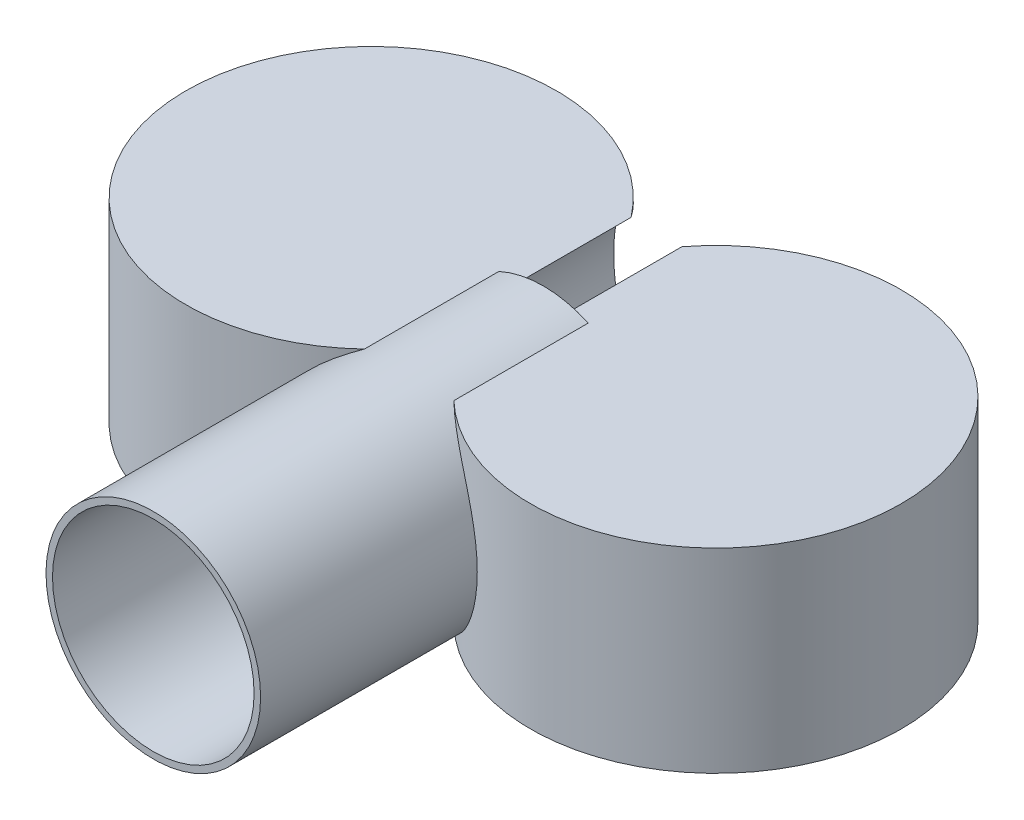
ISO-10303-21;
HEADER;
FILE_DESCRIPTION(('STEP AP214'),'2;1');
FILE_NAME('part.step','',(''),(''),'','','');
FILE_SCHEMA(('AUTOMOTIVE_DESIGN { 1 0 10303 214 1 1 1 1 }'));
ENDSEC;
DATA;
#1=APPLICATION_CONTEXT('core data for automotive mechanical design processes');
#2=APPLICATION_PROTOCOL_DEFINITION('international standard','automotive_design',2000,#1);
#3=PRODUCT_CONTEXT('',#1,'mechanical');
#4=PRODUCT('Part','Part','',(#3));
#5=PRODUCT_RELATED_PRODUCT_CATEGORY('part','',(#4));
#6=PRODUCT_DEFINITION_FORMATION('','',#4);
#7=PRODUCT_DEFINITION_CONTEXT('part definition',#1,'design');
#8=PRODUCT_DEFINITION('design','',#6,#7);
#9=PRODUCT_DEFINITION_SHAPE('','',#8);
#10=(LENGTH_UNIT() NAMED_UNIT(*) SI_UNIT(.MILLI.,.METRE.));
#11=(NAMED_UNIT(*) PLANE_ANGLE_UNIT() SI_UNIT($,.RADIAN.));
#12=(NAMED_UNIT(*) SI_UNIT($,.STERADIAN.) SOLID_ANGLE_UNIT());
#13=UNCERTAINTY_MEASURE_WITH_UNIT(LENGTH_MEASURE(1.E-05),#10,'distance_accuracy_value','');
#14=(GEOMETRIC_REPRESENTATION_CONTEXT(3) GLOBAL_UNCERTAINTY_ASSIGNED_CONTEXT((#13)) GLOBAL_UNIT_ASSIGNED_CONTEXT((#10,
#11,#12)) REPRESENTATION_CONTEXT('',''));
#15=CARTESIAN_POINT('',(0.,0.,0.));
#16=DIRECTION('',(0.,0.,1.));
#17=DIRECTION('',(1.,0.,0.));
#18=AXIS2_PLACEMENT_3D('',#15,#16,#17);
#19=CARTESIAN_POINT('',(-16.0192558049496,30.,0.));
#20=DIRECTION('',(0.,1.,0.));
#21=DIRECTION('',(0.,0.,1.));
#22=AXIS2_PLACEMENT_3D('',#19,#20,#21);
#23=PLANE('',#22);
#24=DIRECTION('',(0.,0.,1.));
#25=VECTOR('',#24,1.);
#26=CARTESIAN_POINT('',(-19.924380642903,30.,-28.5));
#27=LINE('',#26,#25);
#28=CARTESIAN_POINT('',(-19.924380642903,30.,-17.3701357626107));
#29=VERTEX_POINT('',#28);
#30=CARTESIAN_POINT('',(-19.924380642903,30.,0.));
#31=VERTEX_POINT('',#30);
#32=EDGE_CURVE('E53',#29,#31,#27,.T.);
#33=ORIENTED_EDGE('',*,*,#32,.F.);
#34=CARTESIAN_POINT('',(-42.5192558049496,30.,0.));
#35=DIRECTION('',(0.,1.,0.));
#36=DIRECTION('',(0.,0.,1.));
#37=AXIS2_PLACEMENT_3D('',#34,#35,#36);
#38=CIRCLE('',#37,28.5);
#39=CARTESIAN_POINT('',(-22.8931193473834,30.,20.6655454258771));
#40=VERTEX_POINT('',#39);
#41=EDGE_CURVE('E157',#29,#40,#38,.T.);
#42=ORIENTED_EDGE('',*,*,#41,.T.);
#43=DIRECTION('',(0.,0.,-1.));
#44=VECTOR('',#43,1.);
#45=CARTESIAN_POINT('',(-22.8931193473834,30.,60.));
#46=LINE('',#45,#44);
#47=CARTESIAN_POINT('',(-22.8931193473834,30.,0.));
#48=VERTEX_POINT('',#47);
#49=EDGE_CURVE('E131',#40,#48,#46,.T.);
#50=ORIENTED_EDGE('',*,*,#49,.T.);
#51=DIRECTION('',(1.,0.,0.));
#52=VECTOR('',#51,1.);
#53=CARTESIAN_POINT('',(-16.0192558049496,30.,0.));
#54=LINE('',#53,#52);
#55=EDGE_CURVE('E116',#48,#31,#54,.T.);
#56=ORIENTED_EDGE('',*,*,#55,.T.);
#57=EDGE_LOOP('',(#33,#42,#50,#56));
#58=FACE_BOUND('',#57,.T.);
#59=ADVANCED_FACE('F37',(#58),#23,.T.);
#60=CARTESIAN_POINT('',(-16.0192558049496,0.,0.));
#61=DIRECTION('',(0.,1.,0.));
#62=DIRECTION('',(0.,0.,1.));
#63=AXIS2_PLACEMENT_3D('',#60,#61,#62);
#64=PLANE('',#63);
#65=CARTESIAN_POINT('',(-42.5192558049496,0.,0.));
#66=DIRECTION('',(0.,1.,0.));
#67=DIRECTION('',(0.,0.,1.));
#68=AXIS2_PLACEMENT_3D('',#65,#66,#67);
#69=CIRCLE('',#68,28.5);
#70=CARTESIAN_POINT('',(-19.924380642903,0.,-17.3701357626107));
#71=VERTEX_POINT('',#70);
#72=CARTESIAN_POINT('',(-22.8931193473834,0.,20.6655454258771));
#73=VERTEX_POINT('',#72);
#74=EDGE_CURVE('E158',#71,#73,#69,.T.);
#75=ORIENTED_EDGE('',*,*,#74,.F.);
#76=DIRECTION('',(0.,0.,1.));
#77=VECTOR('',#76,1.);
#78=CARTESIAN_POINT('',(-19.924380642903,0.,-28.5));
#79=LINE('',#78,#77);
#80=CARTESIAN_POINT('',(-19.924380642903,0.,0.));
#81=VERTEX_POINT('',#80);
#82=EDGE_CURVE('E185',#71,#81,#79,.T.);
#83=ORIENTED_EDGE('',*,*,#82,.T.);
#84=DIRECTION('',(1.,0.,0.));
#85=VECTOR('',#84,1.);
#86=CARTESIAN_POINT('',(-16.0192558049496,0.,0.));
#87=LINE('',#86,#85);
#88=CARTESIAN_POINT('',(-22.8931193473834,0.,0.));
#89=VERTEX_POINT('',#88);
#90=EDGE_CURVE('E164',#89,#81,#87,.T.);
#91=ORIENTED_EDGE('',*,*,#90,.F.);
#92=DIRECTION('',(0.,0.,-1.));
#93=VECTOR('',#92,1.);
#94=CARTESIAN_POINT('',(-22.8931193473834,0.,60.));
#95=LINE('',#94,#93);
#96=EDGE_CURVE('E167',#73,#89,#95,.T.);
#97=ORIENTED_EDGE('',*,*,#96,.F.);
#98=EDGE_LOOP('',(#75,#83,#91,#97));
#99=FACE_BOUND('',#98,.T.);
#100=ADVANCED_FACE('F212',(#99),#64,.F.);
#101=CARTESIAN_POINT('',(10.4807441950504,30.,0.));
#102=DIRECTION('',(0.,-1.,0.));
#103=DIRECTION('',(0.,0.,-1.));
#104=AXIS2_PLACEMENT_3D('',#101,#102,#103);
#105=CYLINDRICAL_SURFACE('',#104,28.5);
#106=CARTESIAN_POINT('',(10.4807441950504,0.,0.));
#107=DIRECTION('',(0.,1.,0.));
#108=DIRECTION('',(0.,0.,1.));
#109=AXIS2_PLACEMENT_3D('',#106,#107,#108);
#110=CIRCLE('',#109,28.5);
#111=CARTESIAN_POINT('',(-9.14539226251587,0.,20.6655454258771));
#112=VERTEX_POINT('',#111);
#113=CARTESIAN_POINT('',(-12.1141309669963,0.,-17.3701357626107));
#114=VERTEX_POINT('',#113);
#115=EDGE_CURVE('E155',#112,#114,#110,.T.);
#116=ORIENTED_EDGE('',*,*,#115,.T.);
#117=CARTESIAN_POINT('',(-12.1141309669963,0.,-17.3701357626107));
#118=CARTESIAN_POINT('',(-11.9643394035228,0.0389997995964887,-17.5649867570918));
#119=CARTESIAN_POINT('',(-11.8123198583206,0.0809701944037257,-17.7575103783505));
#120=CARTESIAN_POINT('',(-11.5041128860694,0.171335100360802,-18.1376940368291));
#121=CARTESIAN_POINT('',(-11.3479248895952,0.219730492813901,-18.325353402601));
#122=CARTESIAN_POINT('',(-10.8732513591321,0.375376916966445,-18.881054260297));
#123=CARTESIAN_POINT('',(-10.5489909917428,0.493003547680562,-19.2413838368355));
#124=CARTESIAN_POINT('',(-9.88725622133457,0.760040729833842,-19.9405953371826));
#125=CARTESIAN_POINT('',(-9.54972949700646,0.909590211933771,-20.2793748266602));
#126=CARTESIAN_POINT('',(-8.86741901195853,1.24335487315917,-20.9313392681735));
#127=CARTESIAN_POINT('',(-8.52263952433425,1.42755012153694,-21.244538787818));
#128=CARTESIAN_POINT('',(-7.88554667618215,1.80125455755003,-21.7962853684549));
#129=CARTESIAN_POINT('',(-7.59351631634458,1.98536468314365,-22.0388235652972));
#130=CARTESIAN_POINT('',(-7.01169270803424,2.38106434126637,-22.5034039837079));
#131=CARTESIAN_POINT('',(-6.72189948799382,2.59265422243516,-22.7254459451764));
#132=CARTESIAN_POINT('',(-6.14933519157098,3.04312003283263,-23.1477145130866));
#133=CARTESIAN_POINT('',(-5.86654719370049,3.28192035990687,-23.3479986831245));
#134=CARTESIAN_POINT('',(-5.31130217880728,3.78703581245013,-23.7270793114327));
#135=CARTESIAN_POINT('',(-5.03884501613893,4.05335054981966,-23.9058760727126));
#136=CARTESIAN_POINT('',(-4.50726771117636,4.61376415639717,-24.2427093278497));
#137=CARTESIAN_POINT('',(-4.24820771230669,4.90797391099585,-24.4006564412553));
#138=CARTESIAN_POINT('',(-3.74862474770634,5.52169998914601,-24.6953276466742));
#139=CARTESIAN_POINT('',(-3.50810222752306,5.84121692058025,-24.8320512286611));
#140=CARTESIAN_POINT('',(-3.04902800723369,6.50377802766299,-25.0851364838346));
#141=CARTESIAN_POINT('',(-2.83049790895105,6.84684478925737,-25.2014782186559));
#142=CARTESIAN_POINT('',(-2.41890126340133,7.55368551432101,-25.4146197463843));
#143=CARTESIAN_POINT('',(-2.22583366566237,7.9174586226496,-25.511420345561));
#144=CARTESIAN_POINT('',(-1.87857088684386,8.64058217073558,-25.6813638220029));
#145=CARTESIAN_POINT('',(-1.72274302426728,8.99889985607123,-25.7555741422182));
#146=CARTESIAN_POINT('',(-1.43784572572456,9.72876359385339,-25.8886452288691));
#147=CARTESIAN_POINT('',(-1.30877513179847,10.100309073032,-25.9475066595789));
#148=CARTESIAN_POINT('',(-1.07887733405021,10.8538879201915,-26.0507396703101));
#149=CARTESIAN_POINT('',(-0.978042881885634,11.2359185688829,-26.0951149694712));
#150=CARTESIAN_POINT('',(-0.805660131668931,12.0078578706707,-26.170134173868));
#151=CARTESIAN_POINT('',(-0.734112307743402,12.3977666512004,-26.2007778568006));
#152=CARTESIAN_POINT('',(-0.620856469490291,13.1840661824016,-26.2489670386268));
#153=CARTESIAN_POINT('',(-0.579251867130004,13.5804746065453,-26.266467153844));
#154=CARTESIAN_POINT('',(-0.526709327402839,14.3756749094872,-26.2885294576252));
#155=CARTESIAN_POINT('',(-0.51577136292428,14.774466786178,-26.2930916576273));
#156=CARTESIAN_POINT('',(-0.524672952727863,15.5716892810288,-26.2893669879278));
#157=CARTESIAN_POINT('',(-0.544515741908747,15.9701198568146,-26.2810787677134));
#158=CARTESIAN_POINT('',(-0.61478387119505,16.7637906130008,-26.2514895886808));
#159=CARTESIAN_POINT('',(-0.665209356186057,17.1590307782775,-26.2301885682144));
#160=CARTESIAN_POINT('',(-0.796639509136035,17.9466234455669,-26.1739519798813));
#161=CARTESIAN_POINT('',(-0.87788129416651,18.3389288694369,-26.1389106140386));
#162=CARTESIAN_POINT('',(-1.07003007288673,19.1146459121849,-26.0545698482814));
#163=CARTESIAN_POINT('',(-1.18093720092214,19.4980574907767,-26.0052703837961));
#164=CARTESIAN_POINT('',(-1.43115900561939,20.2531514862145,-25.8916091878038));
#165=CARTESIAN_POINT('',(-1.57047020346545,20.6248353329945,-25.8272493006942));
#166=CARTESIAN_POINT('',(-1.8758726677492,21.3538076126325,-25.6825339751768));
#167=CARTESIAN_POINT('',(-2.04196360287517,21.7110962235162,-25.6021787346563));
#168=CARTESIAN_POINT('',(-2.39746523658256,22.4059374542562,-25.4252002575366));
#169=CARTESIAN_POINT('',(-2.5866810772232,22.7436238345238,-25.3287107329343));
#170=CARTESIAN_POINT('',(-2.98704794709004,23.3999594943983,-25.1181151016111));
#171=CARTESIAN_POINT('',(-3.19819874156863,23.7186089776803,-25.0040091834142));
#172=CARTESIAN_POINT('',(-3.63958118592021,24.3347320616506,-24.7574285071341));
#173=CARTESIAN_POINT('',(-3.86980727100044,24.6322117913978,-24.6249590986539));
#174=CARTESIAN_POINT('',(-4.34626992956831,25.2044113792448,-24.3410461112347));
#175=CARTESIAN_POINT('',(-4.59250642967599,25.4791313416453,-24.189602619256));
#176=CARTESIAN_POINT('',(-5.09647210277204,26.0033818690013,-23.8681634494785));
#177=CARTESIAN_POINT('',(-5.35414404720184,26.2530210925452,-23.698255085978));
#178=CARTESIAN_POINT('',(-5.87855631226374,26.7278017433376,-23.3393278745092));
#179=CARTESIAN_POINT('',(-6.14529660893054,26.9529432353207,-23.1503090770423));
#180=CARTESIAN_POINT('',(-6.68448267722995,27.3786124597056,-22.7533969697799));
#181=CARTESIAN_POINT('',(-6.95693039766051,27.5791316190159,-22.5454971294987));
#182=CARTESIAN_POINT('',(-7.50410736945299,27.955793744316,-22.1114691875723));
#183=CARTESIAN_POINT('',(-7.77883665591403,28.1319363345628,-21.8853408050354));
#184=CARTESIAN_POINT('',(-8.34478359026919,28.471007869507,-21.4008605963291));
#185=CARTESIAN_POINT('',(-8.63594876755042,28.6324036107925,-21.1413760251113));
#186=CARTESIAN_POINT('',(-9.21405521305679,28.9300028746471,-20.6038998748905));
#187=CARTESIAN_POINT('',(-9.50099592770492,29.0662031221521,-20.3259058962997));
#188=CARTESIAN_POINT('',(-10.0676261469168,29.3151614500014,-19.7528933087479));
#189=CARTESIAN_POINT('',(-10.3473186540464,29.4279293775679,-19.4578819180631));
#190=CARTESIAN_POINT('',(-10.8971242242333,29.6321477081298,-18.8521607052303));
#191=CARTESIAN_POINT('',(-11.1672401442262,29.7236045149169,-18.5414556331211));
#192=CARTESIAN_POINT('',(-11.547737582795,29.8415064031923,-18.0839440658996));
#193=CARTESIAN_POINT('',(-11.6627711298185,29.8756533715496,-17.9429086300732));
#194=CARTESIAN_POINT('',(-11.8903201480455,29.9404101169034,-17.6583862492576));
#195=CARTESIAN_POINT('',(-12.0028392001668,29.9710252219754,-17.5149033819583));
#196=CARTESIAN_POINT('',(-12.1141309669963,30.,-17.3701357626107));
#197=B_SPLINE_CURVE_WITH_KNOTS('',3,(#117,#118,#119,#120,#121,#122,#123,#124,#125,#126,#127,
#128,#129,#130,#131,#132,#133,#134,#135,#136,#137,#138,#139,#140,#141,#142,#143,#144,#145,#146,
#147,#148,#149,#150,#151,#152,#153,#154,#155,#156,#157,#158,#159,#160,#161,#162,#163,#164,#165,
#166,#167,#168,#169,#170,#171,#172,#173,#174,#175,#176,#177,#178,#179,#180,#181,#182,#183,#184,
#185,#186,#187,#188,#189,#190,#191,#192,#193,#194,#195,#196),.UNSPECIFIED.,.F.,.F.,(4,2,2,2,2,2,
2,2,2,2,2,2,2,2,2,2,2,2,2,2,2,2,2,2,2,2,2,2,2,2,2,2,2,2,2,2,2,2,2,4),(0.,0.746468085594687,
1.49303866862395,2.98784100299674,4.48928652787186,5.98987093997945,7.25428102916193,
8.51870716166821,9.77970211781029,11.0406792896464,12.3068977935395,13.5731467214492,
14.840627512389,16.1080559962231,17.2998103050309,18.4915130281553,19.682909554896,
20.8743253686108,22.0698363671622,23.265346308789,24.4609819008682,25.6566231573179,
26.8616573356116,28.0666969712452,29.2715891070507,30.4764663373979,31.6718126815616,
32.8671462344608,34.0621322949028,35.2571128787947,36.4466702968252,37.6362245714095,
38.8261918618265,40.0161774924818,41.2811871143768,42.5463610545811,43.8110022366964,
45.0752629145378,45.6307339255943,46.185355695872),.UNSPECIFIED.);
#198=CARTESIAN_POINT('',(-12.1141309669963,30.,-17.3701357626107));
#199=VERTEX_POINT('',#198);
#200=EDGE_CURVE('E182',#114,#199,#197,.T.);
#201=ORIENTED_EDGE('',*,*,#200,.T.);
#202=CARTESIAN_POINT('',(10.4807441950504,30.,0.));
#203=DIRECTION('',(0.,1.,0.));
#204=DIRECTION('',(0.,0.,1.));
#205=AXIS2_PLACEMENT_3D('',#202,#203,#204);
#206=CIRCLE('',#205,28.5);
#207=CARTESIAN_POINT('',(-9.14539226251587,30.,20.6655454258771));
#208=VERTEX_POINT('',#207);
#209=EDGE_CURVE('E109',#208,#199,#206,.T.);
#210=ORIENTED_EDGE('',*,*,#209,.F.);
#211=CARTESIAN_POINT('',(-9.14539226251587,0.,20.6655454258771));
#212=CARTESIAN_POINT('',(-8.99034684919225,0.0710509725734352,20.8127965277317));
#213=CARTESIAN_POINT('',(-8.8344480881234,0.145402013919614,20.957530345615));
#214=CARTESIAN_POINT('',(-8.52133903377766,0.300958588947565,21.2418345469368));
#215=CARTESIAN_POINT('',(-8.36412861839283,0.382164767369239,21.3814044429182));
#216=CARTESIAN_POINT('',(-7.89104690993257,0.636491120311163,21.7922381599609));
#217=CARTESIAN_POINT('',(-7.57384374104907,0.820265433371779,22.0555137588335));
#218=CARTESIAN_POINT('',(-6.93972569594383,1.21768167336473,22.5597333268601));
#219=CARTESIAN_POINT('',(-6.62281148725684,1.43135522297681,22.800653197041));
#220=CARTESIAN_POINT('',(-5.99406222899199,1.88906491390524,23.2590211216982));
#221=CARTESIAN_POINT('',(-5.6822259879246,2.13309381310662,23.476474751668));
#222=CARTESIAN_POINT('',(-5.06682475175206,2.65264714741573,23.88850926801));
#223=CARTESIAN_POINT('',(-4.76330300919431,2.92830762233303,24.0829834576576));
#224=CARTESIAN_POINT('',(-4.17067347359483,3.5094247330135,24.4480497072267));
#225=CARTESIAN_POINT('',(-3.88156702739612,3.81488414508327,24.6186395382783));
#226=CARTESIAN_POINT('',(-3.32276672728283,4.4534888860775,24.9362438034048));
#227=CARTESIAN_POINT('',(-3.05304248702504,4.78658903274363,25.0832956040062));
#228=CARTESIAN_POINT('',(-2.53663250762241,5.4786943058999,25.3551393731475));
#229=CARTESIAN_POINT('',(-2.28994521245141,5.8376976798536,25.4799328456409));
#230=CARTESIAN_POINT('',(-1.83791384174138,6.55559261209143,25.7013616623972));
#231=CARTESIAN_POINT('',(-1.63094506742191,6.91306993680374,25.7992746682137));
#232=CARTESIAN_POINT('',(-1.24293787971474,7.64593155390175,25.9778928211292));
#233=CARTESIAN_POINT('',(-1.06189851757271,8.02131519042715,26.0585985978917));
#234=CARTESIAN_POINT('',(-0.727720301277733,8.78760884780028,26.2040756622261));
#235=CARTESIAN_POINT('',(-0.574601913836098,9.17853000439004,26.2688352729803));
#236=CARTESIAN_POINT('',(-0.298097743657628,9.97286799592274,26.3834983154657));
#237=CARTESIAN_POINT('',(-0.174712471045995,10.3762850451213,26.4334014923116));
#238=CARTESIAN_POINT('',(0.0413909770163267,11.1940740650911,26.5194926323541));
#239=CARTESIAN_POINT('',(0.134009823681604,11.6084769421486,26.5556362268177));
#240=CARTESIAN_POINT('',(0.287116558226612,12.4440949211851,26.6147834496794));
#241=CARTESIAN_POINT('',(0.347604509158058,12.8653100097946,26.6377871038626));
#242=CARTESIAN_POINT('',(0.435862158662152,13.711571245228,26.6711937471481));
#243=CARTESIAN_POINT('',(0.463637733310623,14.1366166901844,26.681598999292));
#244=CARTESIAN_POINT('',(0.486230321064228,14.9877080698758,26.6900699978471));
#245=CARTESIAN_POINT('',(0.481046922247502,15.4137540170485,26.6881355900369));
#246=CARTESIAN_POINT('',(0.437381776504455,16.271518278276,26.6717347119691));
#247=CARTESIAN_POINT('',(0.398308229423455,16.7032023620033,26.6570455084418));
#248=CARTESIAN_POINT('',(0.286445194754846,17.5615280526364,26.6144667577238));
#249=CARTESIAN_POINT('',(0.213655273372626,17.9881695945925,26.5865770406953));
#250=CARTESIAN_POINT('',(0.0350717828764364,18.8334298747099,26.5169211296087));
#251=CARTESIAN_POINT('',(-0.0707283529883001,19.2520469989639,26.475152174434));
#252=CARTESIAN_POINT('',(-0.314221250353204,20.0781197893218,26.3768069661421));
#253=CARTESIAN_POINT('',(-0.451913703592535,20.4855755632651,26.3202308561455));
#254=CARTESIAN_POINT('',(-0.757227300194023,21.2851469999379,26.191322088366));
#255=CARTESIAN_POINT('',(-0.924759381558381,21.6773041907969,26.1190361818238));
#256=CARTESIAN_POINT('',(-1.28808119227605,22.4446413992589,25.9573546020984));
#257=CARTESIAN_POINT('',(-1.48387087311601,22.8198214460073,25.8679589582896));
#258=CARTESIAN_POINT('',(-1.90114693748803,23.5501905635638,25.6708384267183));
#259=CARTESIAN_POINT('',(-2.12261470874845,23.9053938402308,25.563126788854));
#260=CARTESIAN_POINT('',(-2.5884762894819,24.5935813398707,25.3281167366376));
#261=CARTESIAN_POINT('',(-2.83286935893549,24.9265662794494,25.2008189544335));
#262=CARTESIAN_POINT('',(-3.33607400770287,25.5616134306365,24.9284111286291));
#263=CARTESIAN_POINT('',(-3.59449042684615,25.8641674042414,24.7837167860838));
#264=CARTESIAN_POINT('',(-4.12666195281708,26.4442623941278,24.473832061594));
#265=CARTESIAN_POINT('',(-4.40041737994376,26.7218028877785,24.3086412515684));
#266=CARTESIAN_POINT('',(-4.95976353878234,27.2509590976119,23.9572511609585));
#267=CARTESIAN_POINT('',(-5.24536403499391,27.502552804014,23.7710343206476));
#268=CARTESIAN_POINT('',(-5.82431567710158,27.9789716569098,23.3777118985319));
#269=CARTESIAN_POINT('',(-6.11766571543313,28.2038006036022,23.170609289928));
#270=CARTESIAN_POINT('',(-6.64056309361739,28.5782380099798,22.7857580187417));
#271=CARTESIAN_POINT('',(-6.86931700088796,28.7332735621658,22.6121671649127));
#272=CARTESIAN_POINT('',(-7.3275120503966,29.0277488160675,22.253105760735));
#273=CARTESIAN_POINT('',(-7.55695314025363,29.1671896769221,22.0676360949412));
#274=CARTESIAN_POINT('',(-8.01435466259529,29.4305584733631,21.6857043874187));
#275=CARTESIAN_POINT('',(-8.24231739152773,29.5545256854638,21.4892720871037));
#276=CARTESIAN_POINT('',(-8.69593189172664,29.787970420074,21.0854843328616));
#277=CARTESIAN_POINT('',(-8.92158392046457,29.8974495734976,20.8781301120901));
#278=CARTESIAN_POINT('',(-9.14539226251587,30.,20.6655454258771));
#279=B_SPLINE_CURVE_WITH_KNOTS('',3,(#211,#212,#213,#214,#215,#216,#217,#218,#219,#220,#221,
#222,#223,#224,#225,#226,#227,#228,#229,#230,#231,#232,#233,#234,#235,#236,#237,#238,#239,#240,
#241,#242,#243,#244,#245,#246,#247,#248,#249,#250,#251,#252,#253,#254,#255,#256,#257,#258,#259,
#260,#261,#262,#263,#264,#265,#266,#267,#268,#269,#270,#271,#272,#273,#274,#275,#276,#277,#278),
.UNSPECIFIED.,.F.,.F.,(4,2,2,2,2,2,2,2,2,2,2,2,2,2,2,2,2,2,2,2,2,2,2,2,2,2,2,2,2,2,2,2,2,4),(0.,
0.675888378149919,1.3518403959841,2.70425866704379,4.05811827812235,5.41165550552388,
6.77124907860817,8.13096944346506,9.48850937862163,10.8459575525738,12.1179950549219,
13.389986001661,14.6629056311635,15.9358470983429,17.2128591702024,18.4898687361219,
19.7666488796966,21.0434449805245,22.3429962712053,23.6425642823674,24.9423909827373,
26.2422051199265,27.5382028149899,28.8341982850787,30.1292601820475,31.424280289312,
32.6929183175628,33.9615828465545,35.2313148388739,36.5008663325228,37.4793188361932,
38.4576985639896,39.4335420774801,40.4092756471111),.UNSPECIFIED.);
#280=EDGE_CURVE('E146',#112,#208,#279,.T.);
#281=ORIENTED_EDGE('',*,*,#280,.F.);
#282=EDGE_LOOP('',(#116,#201,#210,#281));
#283=FACE_BOUND('',#282,.T.);
#284=ADVANCED_FACE('F39',(#283),#105,.T.);
#285=CARTESIAN_POINT('',(-42.5192558049496,30.,0.));
#286=DIRECTION('',(0.,-1.,0.));
#287=DIRECTION('',(0.,0.,-1.));
#288=AXIS2_PLACEMENT_3D('',#285,#286,#287);
#289=CYLINDRICAL_SURFACE('',#288,28.5);
#290=ORIENTED_EDGE('',*,*,#41,.F.);
#291=CARTESIAN_POINT('',(-19.924380642903,30.,-17.3701357626107));
#292=CARTESIAN_POINT('',(-20.0741722063764,29.9610002004035,-17.5649867570918));
#293=CARTESIAN_POINT('',(-20.2261917515786,29.9190298055963,-17.7575103783505));
#294=CARTESIAN_POINT('',(-20.5343987238299,29.8286648996392,-18.1376940368291));
#295=CARTESIAN_POINT('',(-20.690586720304,29.7802695071861,-18.325353402601));
#296=CARTESIAN_POINT('',(-21.1652602507672,29.6246230830336,-18.881054260297));
#297=CARTESIAN_POINT('',(-21.4895206181565,29.5069964523194,-19.2413838368355));
#298=CARTESIAN_POINT('',(-22.1512553885647,29.2399592701662,-19.9405953371826));
#299=CARTESIAN_POINT('',(-22.4887821128928,29.0904097880662,-20.2793748266602));
#300=CARTESIAN_POINT('',(-23.1710925979407,28.7566451268408,-20.9313392681735));
#301=CARTESIAN_POINT('',(-23.515872085565,28.572449878463,-21.2445387878179));
#302=CARTESIAN_POINT('',(-24.1529649337171,28.19874544245,-21.7962853684549));
#303=CARTESIAN_POINT('',(-24.4449952935547,28.0146353168563,-22.0388235652972));
#304=CARTESIAN_POINT('',(-25.026818901865,27.6189356587336,-22.5034039837079));
#305=CARTESIAN_POINT('',(-25.3166121219054,27.4073457775648,-22.7254459451764));
#306=CARTESIAN_POINT('',(-25.8891764183283,26.9568799671674,-23.1477145130866));
#307=CARTESIAN_POINT('',(-26.1719644161988,26.7180796400931,-23.3479986831245));
#308=CARTESIAN_POINT('',(-26.727209431092,26.2129641875499,-23.7270793114327));
#309=CARTESIAN_POINT('',(-26.9996665937603,25.9466494501803,-23.9058760727126));
#310=CARTESIAN_POINT('',(-27.5312438987229,25.3862358436028,-24.2427093278497));
#311=CARTESIAN_POINT('',(-27.7903038975926,25.0920260890041,-24.4006564412553));
#312=CARTESIAN_POINT('',(-28.2898868621929,24.478300010854,-24.6953276466742));
#313=CARTESIAN_POINT('',(-28.5304093823762,24.1587830794197,-24.8320512286611));
#314=CARTESIAN_POINT('',(-28.9894836026656,23.496221972337,-25.0851364838346));
#315=CARTESIAN_POINT('',(-29.2080137009482,23.1531552107426,-25.2014782186559));
#316=CARTESIAN_POINT('',(-29.6196103464979,22.446314485679,-25.4146197463843));
#317=CARTESIAN_POINT('',(-29.8126779442369,22.0825413773504,-25.511420345561));
#318=CARTESIAN_POINT('',(-30.1599407230554,21.3594178292644,-25.6813638220029));
#319=CARTESIAN_POINT('',(-30.315768585632,21.0011001439288,-25.7555741422182));
#320=CARTESIAN_POINT('',(-30.6006658841747,20.2712364061466,-25.8886452288691));
#321=CARTESIAN_POINT('',(-30.7297364781008,19.8996909269679,-25.9475066595789));
#322=CARTESIAN_POINT('',(-30.9596342758491,19.1461120798085,-26.0507396703101));
#323=CARTESIAN_POINT('',(-31.0604687280136,18.7640814311171,-26.0951149694712));
#324=CARTESIAN_POINT('',(-31.2328514782303,17.9921421293293,-26.170134173868));
#325=CARTESIAN_POINT('',(-31.3043993021559,17.6022333487996,-26.2007778568006));
#326=CARTESIAN_POINT('',(-31.417655140409,16.8159338175984,-26.2489670386268));
#327=CARTESIAN_POINT('',(-31.4592597427693,16.4195253934547,-26.266467153844));
#328=CARTESIAN_POINT('',(-31.5118022824964,15.6243250905128,-26.2885294576252));
#329=CARTESIAN_POINT('',(-31.522740246975,15.225533213822,-26.2930916576272));
#330=CARTESIAN_POINT('',(-31.5138386571714,14.4283107189712,-26.2893669879278));
#331=CARTESIAN_POINT('',(-31.4939958679905,14.0298801431854,-26.2810787677134));
#332=CARTESIAN_POINT('',(-31.4237277387042,13.2362093869992,-26.2514895886808));
#333=CARTESIAN_POINT('',(-31.3733022537132,12.8409692217225,-26.2301885682144));
#334=CARTESIAN_POINT('',(-31.2418721007632,12.0533765544331,-26.1739519798813));
#335=CARTESIAN_POINT('',(-31.1606303157327,11.6610711305631,-26.1389106140386));
#336=CARTESIAN_POINT('',(-30.9684815370125,10.8853540878151,-26.0545698482814));
#337=CARTESIAN_POINT('',(-30.8575744089771,10.5019425092233,-26.0052703837961));
#338=CARTESIAN_POINT('',(-30.6073526042799,9.74684851378545,-25.8916091878038));
#339=CARTESIAN_POINT('',(-30.4680414064338,9.37516466700549,-25.8272493006942));
#340=CARTESIAN_POINT('',(-30.1626389421501,8.64619238736748,-25.6825339751768));
#341=CARTESIAN_POINT('',(-29.9965480070241,8.28890377648379,-25.6021787346562));
#342=CARTESIAN_POINT('',(-29.6410463733167,7.59406254574383,-25.4252002575365));
#343=CARTESIAN_POINT('',(-29.4518305326761,7.25637616547619,-25.3287107329343));
#344=CARTESIAN_POINT('',(-29.0514636628092,6.60004050560168,-25.1181151016111));
#345=CARTESIAN_POINT('',(-28.8403128683306,6.28139102231965,-25.0040091834142));
#346=CARTESIAN_POINT('',(-28.398930423979,5.66526793834942,-24.7574285071341));
#347=CARTESIAN_POINT('',(-28.1687043388988,5.36778820860216,-24.6249590986539));
#348=CARTESIAN_POINT('',(-27.692241680331,4.79558862075524,-24.3410461112347));
#349=CARTESIAN_POINT('',(-27.4460051802233,4.52086865835468,-24.189602619256));
#350=CARTESIAN_POINT('',(-26.9420395071272,3.99661813099865,-23.8681634494785));
#351=CARTESIAN_POINT('',(-26.6843675626974,3.74697890745478,-23.6982550859779));
#352=CARTESIAN_POINT('',(-26.1599552976355,3.27219825666237,-23.3393278745092));
#353=CARTESIAN_POINT('',(-25.8932150009687,3.04705676467931,-23.1503090770423));
#354=CARTESIAN_POINT('',(-25.3540289326693,2.62138754029441,-22.7533969697799));
#355=CARTESIAN_POINT('',(-25.0815812122387,2.42086838098411,-22.5454971294987));
#356=CARTESIAN_POINT('',(-24.5344042404463,2.04420625568402,-22.1114691875723));
#357=CARTESIAN_POINT('',(-24.2596749539852,1.86806366543724,-21.8853408050354));
#358=CARTESIAN_POINT('',(-23.6937280196301,1.52899213049305,-21.4008605963291));
#359=CARTESIAN_POINT('',(-23.4025628423488,1.36759638920747,-21.1413760251112));
#360=CARTESIAN_POINT('',(-22.8244563968425,1.06999712535285,-20.6038998748905));
#361=CARTESIAN_POINT('',(-22.5375156821943,0.933796877847933,-20.3259058962997));
#362=CARTESIAN_POINT('',(-21.9708854629824,0.684838549998592,-19.7528933087478));
#363=CARTESIAN_POINT('',(-21.6911929558528,0.572070622432059,-19.4578819180631));
#364=CARTESIAN_POINT('',(-21.141387385666,0.367852291870231,-18.8521607052302));
#365=CARTESIAN_POINT('',(-20.871271465673,0.2763954850831,-18.541455633121));
#366=CARTESIAN_POINT('',(-20.4907740271043,0.158493596807726,-18.0839440658995));
#367=CARTESIAN_POINT('',(-20.3757404800808,0.124346628450374,-17.9429086300732));
#368=CARTESIAN_POINT('',(-20.1481914618537,0.059589883096614,-17.6583862492576));
#369=CARTESIAN_POINT('',(-20.0356724097325,0.0289747780245672,-17.5149033819583));
#370=CARTESIAN_POINT('',(-19.924380642903,0.,-17.3701357626107));
#371=B_SPLINE_CURVE_WITH_KNOTS('',3,(#291,#292,#293,#294,#295,#296,#297,#298,#299,#300,#301,
#302,#303,#304,#305,#306,#307,#308,#309,#310,#311,#312,#313,#314,#315,#316,#317,#318,#319,#320,
#321,#322,#323,#324,#325,#326,#327,#328,#329,#330,#331,#332,#333,#334,#335,#336,#337,#338,#339,
#340,#341,#342,#343,#344,#345,#346,#347,#348,#349,#350,#351,#352,#353,#354,#355,#356,#357,#358,
#359,#360,#361,#362,#363,#364,#365,#366,#367,#368,#369,#370),.UNSPECIFIED.,.F.,.F.,(4,2,2,2,2,2,
2,2,2,2,2,2,2,2,2,2,2,2,2,2,2,2,2,2,2,2,2,2,2,2,2,2,2,2,2,2,2,2,2,4),(0.,0.746468085594686,
1.49303866862395,2.98784100299674,4.48928652787186,5.98987093997946,7.25428102916194,
8.51870716166821,9.77970211781029,11.0406792896465,12.3068977935395,13.5731467214492,
14.840627512389,16.1080559962231,17.2998103050309,18.4915130281553,19.682909554896,
20.8743253686108,22.0698363671622,23.265346308789,24.4609819008682,25.6566231573179,
26.8616573356116,28.0666969712451,29.2715891070507,30.4764663373979,31.6718126815616,
32.8671462344608,34.0621322949028,35.2571128787947,36.4466702968252,37.6362245714095,
38.8261918618265,40.0161774924818,41.2811871143768,42.5463610545811,43.8110022366964,
45.0752629145378,45.6307339255943,46.185355695872),.UNSPECIFIED.);
#372=EDGE_CURVE('E183',#29,#71,#371,.T.);
#373=ORIENTED_EDGE('',*,*,#372,.T.);
#374=ORIENTED_EDGE('',*,*,#74,.T.);
#375=CARTESIAN_POINT('',(-14.0192558049496,31.3783393541592,0.));
#376=CARTESIAN_POINT('',(-14.0192529353531,31.3783231320552,0.347965393707091));
#377=CARTESIAN_POINT('',(-14.0256284307422,31.3791171250124,0.695927832564757));
#378=CARTESIAN_POINT('',(-14.0511138512986,31.382207387199,1.39137546135284));
#379=CARTESIAN_POINT('',(-14.0702236294248,31.384503639082,1.7388606567475));
#380=CARTESIAN_POINT('',(-14.1211511797642,31.3904797849548,2.43283415047402));
#381=CARTESIAN_POINT('',(-14.1529668872939,31.3941594541369,2.77932260156537));
#382=CARTESIAN_POINT('',(-14.2292558380744,31.4026628247566,3.47087178203903));
#383=CARTESIAN_POINT('',(-14.2737291320733,31.407486530781,3.81593250569154));
#384=CARTESIAN_POINT('',(-14.4265504908579,31.4232783466615,4.85163525769571));
#385=CARTESIAN_POINT('',(-14.5540609283418,31.4355338692714,5.53953548364116));
#386=CARTESIAN_POINT('',(-14.8593093433517,31.4598857671198,6.90408340889898));
#387=CARTESIAN_POINT('',(-15.0370523054074,31.47198212644,7.58072998446253));
#388=CARTESIAN_POINT('',(-15.4717261193432,31.4925571809436,9.01802956640977));
#389=CARTESIAN_POINT('',(-15.736471851812,31.500238645838,9.77634493322559));
#390=CARTESIAN_POINT('',(-16.3291704506503,31.499750201472,11.2682533575119));
#391=CARTESIAN_POINT('',(-16.6571386608949,31.4915764398302,12.0018403626141));
#392=CARTESIAN_POINT('',(-17.1938356892276,31.4591079500234,13.0779775474701));
#393=CARTESIAN_POINT('',(-17.3799585071081,31.4449443027406,13.4322657060428));
#394=CARTESIAN_POINT('',(-17.7667674767288,31.4083508653694,14.1323806194934));
#395=CARTESIAN_POINT('',(-17.9674528283437,31.3859215291562,14.478207837856));
#396=CARTESIAN_POINT('',(-18.3827016807972,31.3311953294728,15.1603461566664));
#397=CARTESIAN_POINT('',(-18.5972565994018,31.2989045228867,15.4966629602324));
#398=CARTESIAN_POINT('',(-19.0396927993886,31.2227420271934,16.1591722043014));
#399=CARTESIAN_POINT('',(-19.2675769486411,31.1788678386586,16.4853624427272));
#400=CARTESIAN_POINT('',(-19.8101844429687,31.061708443386,17.2285111020585));
#401=CARTESIAN_POINT('',(-20.1294947441213,30.9835077022747,17.6413815940534));
#402=CARTESIAN_POINT('',(-20.7870085236847,30.7998411490642,18.4452971100385));
#403=CARTESIAN_POINT('',(-21.1252062917186,30.6943835431097,18.8363486599838));
#404=CARTESIAN_POINT('',(-21.8167627752882,30.4522794521719,19.5938621959948));
#405=CARTESIAN_POINT('',(-22.1701026830426,30.3156707969238,19.9603533153648));
#406=CARTESIAN_POINT('',(-22.8879518781779,30.0074474699023,20.6667688349694));
#407=CARTESIAN_POINT('',(-23.2524596402998,29.8358375605033,21.0066968407662));
#408=CARTESIAN_POINT('',(-23.9322719060814,29.4830275620882,21.6089889478816));
#409=CARTESIAN_POINT('',(-24.2467787720644,29.3071035369175,21.8753486825391));
#410=CARTESIAN_POINT('',(-24.8761428588076,28.9262620833815,22.3860385129854));
#411=CARTESIAN_POINT('',(-25.1910000432291,28.7213474263007,22.6303707107888));
#412=CARTESIAN_POINT('',(-25.8168212859225,28.2817133035468,23.0961218182897));
#413=CARTESIAN_POINT('',(-26.1277856615354,28.0469962849675,23.3175426065537));
#414=CARTESIAN_POINT('',(-26.7413664934902,27.5476206195283,23.737024783639));
#415=CARTESIAN_POINT('',(-27.043982819112,27.2829615041429,23.9350858068343));
#416=CARTESIAN_POINT('',(-27.637287411803,26.723401896469,24.3084411937604));
#417=CARTESIAN_POINT('',(-27.9279329449966,26.4284043347145,24.4836581396145));
#418=CARTESIAN_POINT('',(-28.4917719647632,25.8102425053403,24.8110059030787));
#419=CARTESIAN_POINT('',(-28.7649652049662,25.4870778402442,24.9631363948242));
#420=CARTESIAN_POINT('',(-29.2897829807738,24.8145337813461,25.2451947015383));
#421=CARTESIAN_POINT('',(-29.541404911535,24.4651512311296,25.3751198369762));
#422=CARTESIAN_POINT('',(-30.0193482765399,23.7427102169841,25.6139361046849));
#423=CARTESIAN_POINT('',(-30.2456706430414,23.3696526262458,25.722828012112));
#424=CARTESIAN_POINT('',(-30.6572519331711,22.6255482720128,25.9150798910707));
#425=CARTESIAN_POINT('',(-30.8441517829456,22.2556992558812,25.9995725202657));
#426=CARTESIAN_POINT('',(-31.1906081604535,21.500211688725,26.1523920569984));
#427=CARTESIAN_POINT('',(-31.3501658926524,21.1145738341526,26.2207196766821));
#428=CARTESIAN_POINT('',(-31.6401907973116,20.3302191378164,26.3423744563088));
#429=CARTESIAN_POINT('',(-31.7706577111353,19.9315021798069,26.3957014828876));
#430=CARTESIAN_POINT('',(-32.001148086146,19.1237747357562,26.4883908690137));
#431=CARTESIAN_POINT('',(-32.1011708538585,18.7147640154674,26.5277529104616));
#432=CARTESIAN_POINT('',(-32.2707661621519,17.8844500139662,26.5937370537351));
#433=CARTESIAN_POINT('',(-32.3399688422472,17.4630589075135,26.620204751362));
#434=CARTESIAN_POINT('',(-32.445522761084,16.6155807321008,26.6603280970983));
#435=CARTESIAN_POINT('',(-32.4818738646737,16.1894936438286,26.6739836924986));
#436=CARTESIAN_POINT('',(-32.5213812173912,15.3355269513737,26.6888169823576));
#437=CARTESIAN_POINT('',(-32.5245343470789,14.9076471825211,26.6899935042229));
#438=CARTESIAN_POINT('',(-32.497608210301,14.053079263279,26.6798947283261));
#439=CARTESIAN_POINT('',(-32.4675286515185,13.6263911234042,26.6686193210359));
#440=CARTESIAN_POINT('',(-32.3737255724205,12.770815894684,26.6330766626046));
#441=CARTESIAN_POINT('',(-32.3095070780478,12.3419908852272,26.6086181982775));
#442=CARTESIAN_POINT('',(-32.1477699048269,11.4916770046802,26.5459938427332));
#443=CARTESIAN_POINT('',(-32.05025085922,11.0701882144418,26.5078278005462));
#444=CARTESIAN_POINT('',(-31.8229283197695,10.2376347989299,26.4169178586491));
#445=CARTESIAN_POINT('',(-31.6931264944534,9.8265696361234,26.3641747123373));
#446=CARTESIAN_POINT('',(-31.4026483847918,9.01787577349882,26.2430140053287));
#447=CARTESIAN_POINT('',(-31.2419725118605,8.62024689471761,26.1745966534972));
#448=CARTESIAN_POINT('',(-30.8928923546786,7.84426158487513,26.0214086367749));
#449=CARTESIAN_POINT('',(-30.7047018706704,7.46578439574749,25.9367626241392));
#450=CARTESIAN_POINT('',(-30.3019915086915,6.72774715075007,25.749519042716));
#451=CARTESIAN_POINT('',(-30.0874718532346,6.36818693504542,25.6469216256368));
#452=CARTESIAN_POINT('',(-29.6349126982288,5.67065555838418,25.4225772047895));
#453=CARTESIAN_POINT('',(-29.3968808946058,5.33267739250136,25.3008364592861));
#454=CARTESIAN_POINT('',(-28.90042794927,4.68043771200492,25.0371022613822));
#455=CARTESIAN_POINT('',(-28.6420071815338,4.36617576259271,24.8951091804136));
#456=CARTESIAN_POINT('',(-28.1136098853071,3.76913215602551,24.5930501511085));
#457=CARTESIAN_POINT('',(-27.8439604553184,3.48585303829812,24.433394429025));
#458=CARTESIAN_POINT('',(-27.2921662125664,2.94509567329921,24.0933752429023));
#459=CARTESIAN_POINT('',(-27.0100216606238,2.68761688784222,23.9130122109785));
#460=CARTESIAN_POINT('',(-26.4370403382517,2.19916009634982,23.531484956511));
#461=CARTESIAN_POINT('',(-26.1462038514562,1.96818122676084,23.3303214122007));
#462=CARTESIAN_POINT('',(-25.5596193011159,1.53282149618768,22.9074540556069));
#463=CARTESIAN_POINT('',(-25.2638710908607,1.32844143131156,22.6857496288702));
#464=CARTESIAN_POINT('',(-24.6630569074527,0.940625446887801,22.2161077878253));
#465=CARTESIAN_POINT('',(-24.3579561630876,0.757909779662398,21.9676211437392));
#466=CARTESIAN_POINT('',(-23.7500900090733,0.419008168566138,21.4505861264112));
#467=CARTESIAN_POINT('',(-23.4473245919871,0.262822140175807,21.1820378170868));
#468=CARTESIAN_POINT('',(-22.8472591804647,-0.0246165505217072,20.6259525165095));
#469=CARTESIAN_POINT('',(-22.5499612589634,-0.155859925248586,20.3384085055646));
#470=CARTESIAN_POINT('',(-21.9636999098867,-0.395255332936485,19.7457092568762));
#471=CARTESIAN_POINT('',(-21.6747382676635,-0.503402450742465,19.4405502879796));
#472=CARTESIAN_POINT('',(-20.9797523277956,-0.742705326266025,18.6728425567565));
#473=CARTESIAN_POINT('',(-20.5796169056363,-0.862287984314217,18.2013060014641));
#474=CARTESIAN_POINT('',(-19.8074397583842,-1.06421817793495,17.228167203257));
#475=CARTESIAN_POINT('',(-19.4354091171075,-1.14655108634854,16.7265532370152));
#476=CARTESIAN_POINT('',(-18.722862464795,-1.28103806721593,15.6963259720994));
#477=CARTESIAN_POINT('',(-18.3824034851384,-1.33313838635183,15.1676663908546));
#478=CARTESIAN_POINT('',(-17.7365805725935,-1.41361327849347,14.087757449103));
#479=CARTESIAN_POINT('',(-17.4312134921498,-1.4419899808154,13.5365101206221));
#480=CARTESIAN_POINT('',(-16.8506922030578,-1.4816676245585,12.4012457565004));
#481=CARTESIAN_POINT('',(-16.5764244637139,-1.49254838395818,11.8167618723456));
#482=CARTESIAN_POINT('',(-16.0681632309475,-1.50188556761876,10.6304369901157));
#483=CARTESIAN_POINT('',(-15.8341723260368,-1.50034119364546,10.0285948793622));
#484=CARTESIAN_POINT('',(-15.4078150771051,-1.49004451632973,8.8110968276509));
#485=CARTESIAN_POINT('',(-15.2154078652605,-1.48129933087787,8.19545511173287));
#486=CARTESIAN_POINT('',(-14.8728080156541,-1.46101914490281,6.9526470571664));
#487=CARTESIAN_POINT('',(-14.722609644139,-1.44948452369993,6.32548229618035));
#488=CARTESIAN_POINT('',(-14.4983784262437,-1.43003408627695,5.22578544723867));
#489=CARTESIAN_POINT('',(-14.414693475552,-1.42195372065187,4.75519967018353));
#490=CARTESIAN_POINT('',(-14.2710911112965,-1.40728966853167,3.8104384889925));
#491=CARTESIAN_POINT('',(-14.2111708600927,-1.40070580338599,3.33626352032115));
#492=CARTESIAN_POINT('',(-14.1152688559778,-1.38984957842152,2.38570306381037));
#493=CARTESIAN_POINT('',(-14.0792746484078,-1.38557601619538,1.90931885624485));
#494=CARTESIAN_POINT('',(-14.0432691122158,-1.38125760779942,1.19383420286352));
#495=CARTESIAN_POINT('',(-14.0342648952054,-1.38016678932332,0.955161887033723));
#496=CARTESIAN_POINT('',(-14.0222582235643,-1.37870632402741,0.477663153487648));
#497=CARTESIAN_POINT('',(-14.0192557938708,-1.37833668020403,0.238836735135213));
#498=CARTESIAN_POINT('',(-14.0192558049496,-1.3783393541592,0.));
#499=B_SPLINE_CURVE_WITH_KNOTS('',3,(#375,#376,#377,#378,#379,#380,#381,#382,#383,#384,#385,
#386,#387,#388,#389,#390,#391,#392,#393,#394,#395,#396,#397,#398,#399,#400,#401,#402,#403,#404,
#405,#406,#407,#408,#409,#410,#411,#412,#413,#414,#415,#416,#417,#418,#419,#420,#421,#422,#423,
#424,#425,#426,#427,#428,#429,#430,#431,#432,#433,#434,#435,#436,#437,#438,#439,#440,#441,#442,
#443,#444,#445,#446,#447,#448,#449,#450,#451,#452,#453,#454,#455,#456,#457,#458,#459,#460,#461,
#462,#463,#464,#465,#466,#467,#468,#469,#470,#471,#472,#473,#474,#475,#476,#477,#478,#479,#480,
#481,#482,#483,#484,#485,#486,#487,#488,#489,#490,#491,#492,#493,#494,#495,#496,#497,#498),
.UNSPECIFIED.,.F.,.F.,(4,2,2,2,2,2,2,2,2,2,2,2,2,2,2,2,2,2,2,2,2,2,2,2,2,2,2,2,2,2,2,2,2,2,2,2,
2,2,2,2,2,2,2,2,2,2,2,2,2,2,2,2,2,2,2,2,2,2,2,2,2,4),(0.,1.04383128203094,2.08765051128085,
3.13130019134022,4.17495405576216,6.27205196238087,8.3693580353082,10.7761490709493,
13.1835249634686,14.3845229004587,15.5854548995883,16.7856507684517,17.9861058239494,
19.5679611810598,21.1493408472258,22.7288102229057,24.3080648344975,25.6510444070878,
26.9938956876483,28.3366367769215,29.6793988799319,31.0265994051984,32.3738189443929,
33.7212009385958,35.0685332670572,36.3358051124872,37.6030211181344,38.8702483897204,
40.1375045247918,41.4195837194315,42.7016681885363,43.9838731273467,45.2660893446075,
46.5674245615362,47.8687741112971,49.1700564151036,50.4713213797884,51.7629651362387,
53.0545979774719,54.3458094375005,55.6369972194946,56.9027985500481,58.1685734709513,
59.4343071322859,60.7000786685986,62.0002540406762,63.3004252705111,64.6010796841632,
65.9020106171539,67.7888362485732,69.6764021532968,71.5673139334408,73.4580559763356,
75.3935621665945,77.3291927015616,79.262912189443,81.196368868972,82.6299096508382,
84.0632792082206,85.4959020421342,86.2123695235176,86.9288399817717),.UNSPECIFIED.);
#500=EDGE_CURVE('E119',#40,#73,#499,.T.);
#501=ORIENTED_EDGE('',*,*,#500,.F.);
#502=EDGE_LOOP('',(#290,#373,#374,#501));
#503=FACE_BOUND('',#502,.T.);
#504=ADVANCED_FACE('F133',(#503),#289,.T.);
#505=DIRECTION('',(0.,0.,1.));
#506=VECTOR('',#505,1.);
#507=CARTESIAN_POINT('',(-12.1141309669963,30.,-28.5));
#508=LINE('',#507,#506);
#509=CARTESIAN_POINT('',(-12.1141309669963,30.,0.));
#510=VERTEX_POINT('',#509);
#511=EDGE_CURVE('E101',#510,#199,#508,.F.);
#512=ORIENTED_EDGE('',*,*,#511,.F.);
#513=CARTESIAN_POINT('',(-9.14539226251587,30.,0.));
#514=VERTEX_POINT('',#513);
#515=EDGE_CURVE('E60',#510,#514,#54,.T.);
#516=ORIENTED_EDGE('',*,*,#515,.T.);
#517=DIRECTION('',(0.,0.,-1.));
#518=VECTOR('',#517,1.);
#519=CARTESIAN_POINT('',(-9.14539226251587,30.,60.));
#520=LINE('',#519,#518);
#521=EDGE_CURVE('E153',#514,#208,#520,.F.);
#522=ORIENTED_EDGE('',*,*,#521,.T.);
#523=ORIENTED_EDGE('',*,*,#209,.T.);
#524=EDGE_LOOP('',(#512,#516,#522,#523));
#525=FACE_BOUND('',#524,.T.);
#526=ADVANCED_FACE('F107',(#525),#23,.T.);
#527=CARTESIAN_POINT('',(-12.1141309669963,0.,0.));
#528=VERTEX_POINT('',#527);
#529=CARTESIAN_POINT('',(-9.14539226251587,0.,0.));
#530=VERTEX_POINT('',#529);
#531=EDGE_CURVE('E160',#528,#530,#87,.T.);
#532=ORIENTED_EDGE('',*,*,#531,.F.);
#533=DIRECTION('',(0.,0.,1.));
#534=VECTOR('',#533,1.);
#535=CARTESIAN_POINT('',(-12.1141309669963,0.,-28.5));
#536=LINE('',#535,#534);
#537=EDGE_CURVE('E180',#528,#114,#536,.F.);
#538=ORIENTED_EDGE('',*,*,#537,.T.);
#539=ORIENTED_EDGE('',*,*,#115,.F.);
#540=DIRECTION('',(0.,0.,-1.));
#541=VECTOR('',#540,1.);
#542=CARTESIAN_POINT('',(-9.14539226251587,0.,60.));
#543=LINE('',#542,#541);
#544=EDGE_CURVE('E46',#530,#112,#543,.F.);
#545=ORIENTED_EDGE('',*,*,#544,.F.);
#546=EDGE_LOOP('',(#532,#538,#539,#545));
#547=FACE_BOUND('',#546,.T.);
#548=ADVANCED_FACE('F178',(#547),#64,.F.);
#549=CARTESIAN_POINT('',(-16.0192558049496,15.,0.));
#550=DIRECTION('',(0.,0.,1.));
#551=DIRECTION('',(1.,0.,0.));
#552=AXIS2_PLACEMENT_3D('',#549,#550,#551);
#553=PLANE('',#552);
#554=ORIENTED_EDGE('',*,*,#90,.T.);
#555=CARTESIAN_POINT('',(-16.0192558049496,15.,0.));
#556=DIRECTION('',(0.,0.,1.));
#557=DIRECTION('',(1.,0.,0.));
#558=AXIS2_PLACEMENT_3D('',#555,#556,#557);
#559=CIRCLE('',#558,15.5);
#560=EDGE_CURVE('E233',#81,#528,#559,.T.);
#561=ORIENTED_EDGE('',*,*,#560,.T.);
#562=ORIENTED_EDGE('',*,*,#531,.T.);
#563=CARTESIAN_POINT('',(-16.0192558049496,15.,0.));
#564=DIRECTION('',(0.,0.,1.));
#565=DIRECTION('',(1.,0.,0.));
#566=AXIS2_PLACEMENT_3D('',#563,#564,#565);
#567=CIRCLE('',#566,16.5);
#568=EDGE_CURVE('E174',#89,#530,#567,.T.);
#569=ORIENTED_EDGE('',*,*,#568,.F.);
#570=EDGE_LOOP('',(#554,#561,#562,#569));
#571=FACE_BOUND('',#570,.T.);
#572=ADVANCED_FACE('F142',(#571),#553,.F.);
#573=CARTESIAN_POINT('',(-16.0192558049496,15.,60.));
#574=DIRECTION('',(0.,0.,-1.));
#575=DIRECTION('',(-1.,0.,0.));
#576=AXIS2_PLACEMENT_3D('',#573,#574,#575);
#577=CYLINDRICAL_SURFACE('',#576,16.5);
#578=ORIENTED_EDGE('',*,*,#521,.F.);
#579=EDGE_CURVE('E115',#514,#48,#567,.T.);
#580=ORIENTED_EDGE('',*,*,#579,.T.);
#581=ORIENTED_EDGE('',*,*,#49,.F.);
#582=ORIENTED_EDGE('',*,*,#500,.T.);
#583=ORIENTED_EDGE('',*,*,#96,.T.);
#584=ORIENTED_EDGE('',*,*,#568,.T.);
#585=ORIENTED_EDGE('',*,*,#544,.T.);
#586=ORIENTED_EDGE('',*,*,#280,.T.);
#587=EDGE_LOOP('',(#578,#580,#581,#582,#583,#584,#585,#586));
#588=FACE_BOUND('',#587,.T.);
#589=CARTESIAN_POINT('',(-16.0192558049496,15.,60.));
#590=DIRECTION('',(0.,0.,1.));
#591=DIRECTION('',(1.,0.,0.));
#592=AXIS2_PLACEMENT_3D('',#589,#590,#591);
#593=CIRCLE('',#592,16.5);
#594=CARTESIAN_POINT('',(0.48074419505037,15.,60.));
#595=VERTEX_POINT('',#594);
#596=EDGE_CURVE('E117',#595,#595,#593,.T.);
#597=ORIENTED_EDGE('',*,*,#596,.F.);
#598=EDGE_LOOP('',(#597));
#599=FACE_BOUND('',#598,.T.);
#600=ADVANCED_FACE('F136',(#588,#599),#577,.T.);
#601=CARTESIAN_POINT('',(-16.0192558049496,15.,60.));
#602=DIRECTION('',(0.,0.,1.));
#603=DIRECTION('',(1.,0.,0.));
#604=AXIS2_PLACEMENT_3D('',#601,#602,#603);
#605=PLANE('',#604);
#606=CARTESIAN_POINT('',(-16.0192558049496,15.,60.));
#607=DIRECTION('',(0.,0.,1.));
#608=DIRECTION('',(1.,0.,0.));
#609=AXIS2_PLACEMENT_3D('',#606,#607,#608);
#610=CIRCLE('',#609,15.5);
#611=CARTESIAN_POINT('',(-0.519255804949631,15.,60.));
#612=VERTEX_POINT('',#611);
#613=EDGE_CURVE('E110',#612,#612,#610,.T.);
#614=ORIENTED_EDGE('',*,*,#613,.F.);
#615=EDGE_LOOP('',(#614));
#616=FACE_BOUND('',#615,.T.);
#617=ORIENTED_EDGE('',*,*,#596,.T.);
#618=EDGE_LOOP('',(#617));
#619=FACE_BOUND('',#618,.T.);
#620=ADVANCED_FACE('F141',(#616,#619),#605,.T.);
#621=ORIENTED_EDGE('',*,*,#515,.F.);
#622=CARTESIAN_POINT('',(-16.0192558049496,15.,0.));
#623=DIRECTION('',(0.,0.,1.));
#624=DIRECTION('',(1.,0.,0.));
#625=AXIS2_PLACEMENT_3D('',#622,#623,#624);
#626=CIRCLE('',#625,15.5);
#627=EDGE_CURVE('E11',#510,#31,#626,.T.);
#628=ORIENTED_EDGE('',*,*,#627,.T.);
#629=ORIENTED_EDGE('',*,*,#55,.F.);
#630=ORIENTED_EDGE('',*,*,#579,.F.);
#631=EDGE_LOOP('',(#621,#628,#629,#630));
#632=FACE_BOUND('',#631,.T.);
#633=ADVANCED_FACE('F113',(#632),#553,.F.);
#634=CARTESIAN_POINT('',(-16.0192558049496,15.,-28.5));
#635=DIRECTION('',(0.,0.,1.));
#636=DIRECTION('',(1.,0.,0.));
#637=AXIS2_PLACEMENT_3D('',#634,#635,#636);
#638=CYLINDRICAL_SURFACE('',#637,15.5);
#639=ORIENTED_EDGE('',*,*,#613,.T.);
#640=EDGE_LOOP('',(#639));
#641=FACE_BOUND('',#640,.T.);
#642=ORIENTED_EDGE('',*,*,#82,.F.);
#643=ORIENTED_EDGE('',*,*,#372,.F.);
#644=ORIENTED_EDGE('',*,*,#32,.T.);
#645=ORIENTED_EDGE('',*,*,#627,.F.);
#646=ORIENTED_EDGE('',*,*,#511,.T.);
#647=ORIENTED_EDGE('',*,*,#200,.F.);
#648=ORIENTED_EDGE('',*,*,#537,.F.);
#649=ORIENTED_EDGE('',*,*,#560,.F.);
#650=EDGE_LOOP('',(#642,#643,#644,#645,#646,#647,#648,#649));
#651=FACE_BOUND('',#650,.T.);
#652=ADVANCED_FACE('F100',(#641,#651),#638,.F.);
#653=CLOSED_SHELL('',(#59,#100,#284,#504,#526,#548,#572,#600,#620,#633,#652));
#654=MANIFOLD_SOLID_BREP('B2',#653);
#655=ADVANCED_BREP_SHAPE_REPRESENTATION('',(#18,#654),#14);
#656=SHAPE_DEFINITION_REPRESENTATION(#9,#655);
ENDSEC;
END-ISO-10303-21;
